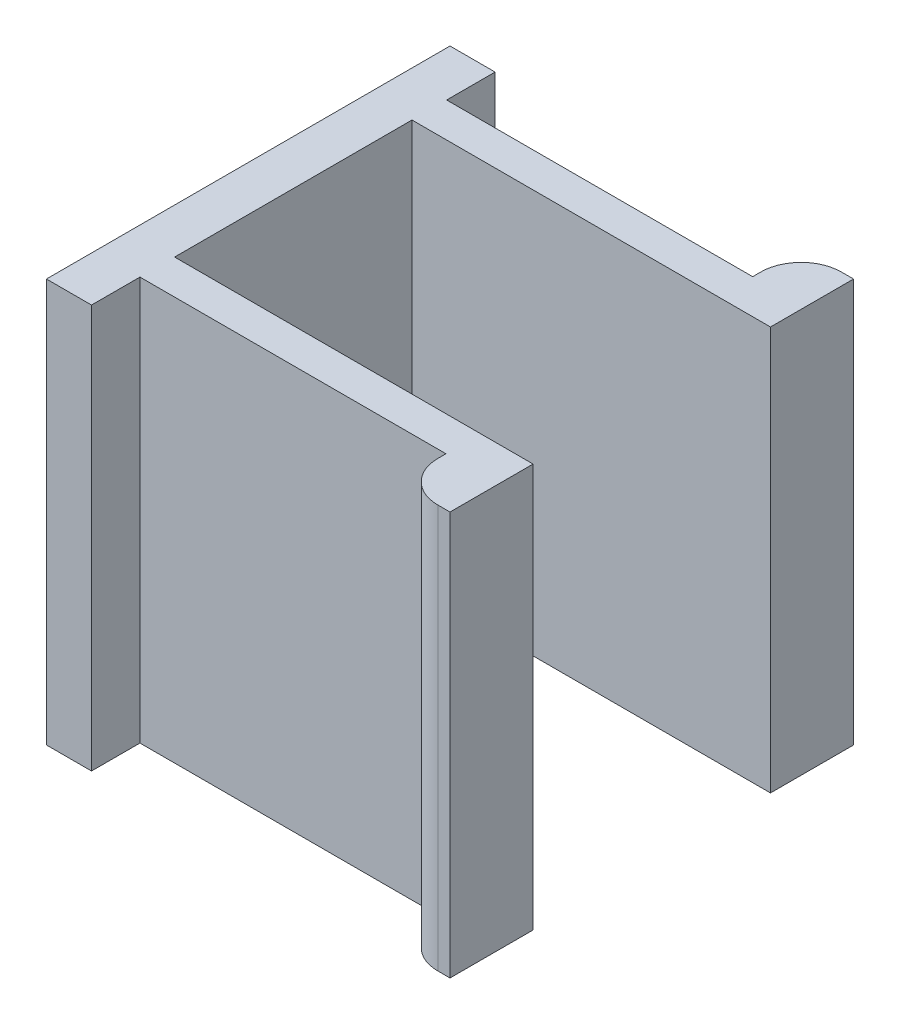
ISO-10303-21;
HEADER;
FILE_DESCRIPTION(('STEP AP214'),'2;1');
FILE_NAME('part.step','',(''),(''),'','','');
FILE_SCHEMA(('AUTOMOTIVE_DESIGN { 1 0 10303 214 1 1 1 1 }'));
ENDSEC;
DATA;
#1=APPLICATION_CONTEXT('core data for automotive mechanical design processes');
#2=APPLICATION_PROTOCOL_DEFINITION('international standard','automotive_design',2000,#1);
#3=PRODUCT_CONTEXT('',#1,'mechanical');
#4=PRODUCT('Part','Part','',(#3));
#5=PRODUCT_RELATED_PRODUCT_CATEGORY('part','',(#4));
#6=PRODUCT_DEFINITION_FORMATION('','',#4);
#7=PRODUCT_DEFINITION_CONTEXT('part definition',#1,'design');
#8=PRODUCT_DEFINITION('design','',#6,#7);
#9=PRODUCT_DEFINITION_SHAPE('','',#8);
#10=(LENGTH_UNIT() NAMED_UNIT(*) SI_UNIT(.MILLI.,.METRE.));
#11=(NAMED_UNIT(*) PLANE_ANGLE_UNIT() SI_UNIT($,.RADIAN.));
#12=(NAMED_UNIT(*) SI_UNIT($,.STERADIAN.) SOLID_ANGLE_UNIT());
#13=UNCERTAINTY_MEASURE_WITH_UNIT(LENGTH_MEASURE(1.E-05),#10,'distance_accuracy_value','');
#14=(GEOMETRIC_REPRESENTATION_CONTEXT(3) GLOBAL_UNCERTAINTY_ASSIGNED_CONTEXT((#13)) GLOBAL_UNIT_ASSIGNED_CONTEXT((#10,
#11,#12)) REPRESENTATION_CONTEXT('',''));
#15=CARTESIAN_POINT('',(0.,0.,0.));
#16=DIRECTION('',(0.,0.,1.));
#17=DIRECTION('',(1.,0.,0.));
#18=AXIS2_PLACEMENT_3D('',#15,#16,#17);
#19=CARTESIAN_POINT('',(-50.,100.,100.));
#20=DIRECTION('',(1.,0.,0.));
#21=DIRECTION('',(0.,1.,0.));
#22=AXIS2_PLACEMENT_3D('',#19,#20,#21);
#23=PLANE('',#22);
#24=DIRECTION('',(0.,-1.,0.));
#25=VECTOR('',#24,1.);
#26=CARTESIAN_POINT('',(-50.,100.,0.));
#27=LINE('',#26,#25);
#28=CARTESIAN_POINT('',(-50.,100.,0.));
#29=VERTEX_POINT('',#28);
#30=CARTESIAN_POINT('',(-50.,0.,0.));
#31=VERTEX_POINT('',#30);
#32=EDGE_CURVE('E292',#29,#31,#27,.T.);
#33=ORIENTED_EDGE('',*,*,#32,.T.);
#34=DIRECTION('',(0.,0.,-1.));
#35=VECTOR('',#34,1.);
#36=CARTESIAN_POINT('',(-50.,0.,100.));
#37=LINE('',#36,#35);
#38=CARTESIAN_POINT('',(-50.,0.,100.));
#39=VERTEX_POINT('',#38);
#40=EDGE_CURVE('E11',#39,#31,#37,.T.);
#41=ORIENTED_EDGE('',*,*,#40,.F.);
#42=DIRECTION('',(0.,-1.,0.));
#43=VECTOR('',#42,1.);
#44=CARTESIAN_POINT('',(-50.,100.,100.));
#45=LINE('',#44,#43);
#46=CARTESIAN_POINT('',(-50.,100.,100.));
#47=VERTEX_POINT('',#46);
#48=EDGE_CURVE('E298',#47,#39,#45,.T.);
#49=ORIENTED_EDGE('',*,*,#48,.F.);
#50=DIRECTION('',(0.,0.,-1.));
#51=VECTOR('',#50,1.);
#52=CARTESIAN_POINT('',(-50.,100.,100.));
#53=LINE('',#52,#51);
#54=EDGE_CURVE('E312',#47,#29,#53,.T.);
#55=ORIENTED_EDGE('',*,*,#54,.T.);
#56=EDGE_LOOP('',(#33,#41,#49,#55));
#57=FACE_BOUND('',#56,.T.);
#58=DIRECTION('',(0.,1.,0.));
#59=VECTOR('',#58,1.);
#60=CARTESIAN_POINT('',(-50.,5.86274890767412,93.4827144054893));
#61=LINE('',#60,#59);
#62=CARTESIAN_POINT('',(-50.,5.86274890767412,93.4827144054893));
#63=VERTEX_POINT('',#62);
#64=CARTESIAN_POINT('',(-50.,94.3657532036184,93.4827144054893));
#65=VERTEX_POINT('',#64);
#66=EDGE_CURVE('E201',#63,#65,#61,.T.);
#67=ORIENTED_EDGE('',*,*,#66,.F.);
#68=DIRECTION('',(0.,0.,1.));
#69=VECTOR('',#68,1.);
#70=CARTESIAN_POINT('',(-50.,5.86274890767412,93.4827144054893));
#71=LINE('',#70,#69);
#72=CARTESIAN_POINT('',(-50.,5.86274890767413,4.74875399562791));
#73=VERTEX_POINT('',#72);
#74=EDGE_CURVE('E198',#73,#63,#71,.T.);
#75=ORIENTED_EDGE('',*,*,#74,.F.);
#76=DIRECTION('',(0.,-1.,0.));
#77=VECTOR('',#76,1.);
#78=CARTESIAN_POINT('',(-50.,5.86274890767412,4.74875399562791));
#79=LINE('',#78,#77);
#80=CARTESIAN_POINT('',(-50.,94.3657532036184,4.74875399562791));
#81=VERTEX_POINT('',#80);
#82=EDGE_CURVE('E52',#81,#73,#79,.T.);
#83=ORIENTED_EDGE('',*,*,#82,.F.);
#84=DIRECTION('',(0.,0.,-1.));
#85=VECTOR('',#84,1.);
#86=CARTESIAN_POINT('',(-50.,94.3657532036184,93.4827144054893));
#87=LINE('',#86,#85);
#88=EDGE_CURVE('E47',#65,#81,#87,.T.);
#89=ORIENTED_EDGE('',*,*,#88,.F.);
#90=EDGE_LOOP('',(#67,#75,#83,#89));
#91=FACE_BOUND('',#90,.T.);
#92=ADVANCED_FACE('F33',(#57,#91),#23,.F.);
#93=CARTESIAN_POINT('',(-50.,0.,100.));
#94=DIRECTION('',(0.,1.,0.));
#95=DIRECTION('',(0.,0.,1.));
#96=AXIS2_PLACEMENT_3D('',#93,#94,#95);
#97=PLANE('',#96);
#98=CARTESIAN_POINT('',(47.,0.,90.));
#99=DIRECTION('',(0.,1.,0.));
#100=DIRECTION('',(0.,0.,1.));
#101=AXIS2_PLACEMENT_3D('',#98,#99,#100);
#102=CIRCLE('',#101,10.);
#103=CARTESIAN_POINT('',(37.,0.,89.9999999999999));
#104=VERTEX_POINT('',#103);
#105=CARTESIAN_POINT('',(47.0000000000001,0.,100.));
#106=VERTEX_POINT('',#105);
#107=EDGE_CURVE('E211',#104,#106,#102,.T.);
#108=ORIENTED_EDGE('',*,*,#107,.F.);
#109=DIRECTION('',(0.,0.,1.));
#110=VECTOR('',#109,1.);
#111=CARTESIAN_POINT('',(37.,0.,0.));
#112=LINE('',#111,#110);
#113=CARTESIAN_POINT('',(37.,0.,88.));
#114=VERTEX_POINT('',#113);
#115=EDGE_CURVE('E213',#114,#104,#112,.T.);
#116=ORIENTED_EDGE('',*,*,#115,.F.);
#117=DIRECTION('',(1.,0.,0.));
#118=VECTOR('',#117,1.);
#119=CARTESIAN_POINT('',(0.,0.,88.));
#120=LINE('',#119,#118);
#121=CARTESIAN_POINT('',(-38.8271021950146,0.,88.));
#122=VERTEX_POINT('',#121);
#123=EDGE_CURVE('E216',#122,#114,#120,.T.);
#124=ORIENTED_EDGE('',*,*,#123,.F.);
#125=DIRECTION('',(0.,0.,-1.));
#126=VECTOR('',#125,1.);
#127=CARTESIAN_POINT('',(-38.8271021950146,0.,0.));
#128=LINE('',#127,#126);
#129=CARTESIAN_POINT('',(-38.8271021950146,0.,100.));
#130=VERTEX_POINT('',#129);
#131=EDGE_CURVE('E218',#130,#122,#128,.T.);
#132=ORIENTED_EDGE('',*,*,#131,.F.);
#133=DIRECTION('',(1.,0.,0.));
#134=VECTOR('',#133,1.);
#135=CARTESIAN_POINT('',(-50.,0.,100.));
#136=LINE('',#135,#134);
#137=EDGE_CURVE('E303',#39,#130,#136,.T.);
#138=ORIENTED_EDGE('',*,*,#137,.F.);
#139=ORIENTED_EDGE('',*,*,#40,.T.);
#140=DIRECTION('',(1.,0.,0.));
#141=VECTOR('',#140,1.);
#142=CARTESIAN_POINT('',(-50.,0.,0.));
#143=LINE('',#142,#141);
#144=CARTESIAN_POINT('',(-38.8271021950146,0.,0.));
#145=VERTEX_POINT('',#144);
#146=EDGE_CURVE('E316',#31,#145,#143,.T.);
#147=ORIENTED_EDGE('',*,*,#146,.T.);
#148=DIRECTION('',(0.,0.,1.));
#149=VECTOR('',#148,1.);
#150=CARTESIAN_POINT('',(-38.8271021950146,0.,0.));
#151=LINE('',#150,#149);
#152=CARTESIAN_POINT('',(-38.8271021950146,0.,12.));
#153=VERTEX_POINT('',#152);
#154=EDGE_CURVE('E251',#145,#153,#151,.T.);
#155=ORIENTED_EDGE('',*,*,#154,.T.);
#156=DIRECTION('',(1.,0.,0.));
#157=VECTOR('',#156,1.);
#158=CARTESIAN_POINT('',(0.,0.,12.));
#159=LINE('',#158,#157);
#160=CARTESIAN_POINT('',(37.,0.,12.));
#161=VERTEX_POINT('',#160);
#162=EDGE_CURVE('E254',#153,#161,#159,.T.);
#163=ORIENTED_EDGE('',*,*,#162,.T.);
#164=DIRECTION('',(0.,0.,-1.));
#165=VECTOR('',#164,1.);
#166=CARTESIAN_POINT('',(37.,0.,0.));
#167=LINE('',#166,#165);
#168=CARTESIAN_POINT('',(37.,0.,10.0000000000001));
#169=VERTEX_POINT('',#168);
#170=EDGE_CURVE('E244',#161,#169,#167,.T.);
#171=ORIENTED_EDGE('',*,*,#170,.T.);
#172=CARTESIAN_POINT('',(47.,0.,10.));
#173=DIRECTION('',(0.,1.,0.));
#174=DIRECTION('',(0.,0.,1.));
#175=AXIS2_PLACEMENT_3D('',#172,#173,#174);
#176=CIRCLE('',#175,10.);
#177=CARTESIAN_POINT('',(47.0000000000001,0.,0.));
#178=VERTEX_POINT('',#177);
#179=EDGE_CURVE('E247',#169,#178,#176,.F.);
#180=ORIENTED_EDGE('',*,*,#179,.T.);
#181=CARTESIAN_POINT('',(50.,0.,0.));
#182=VERTEX_POINT('',#181);
#183=EDGE_CURVE('E315',#178,#182,#143,.T.);
#184=ORIENTED_EDGE('',*,*,#183,.T.);
#185=DIRECTION('',(0.,0.,-1.));
#186=VECTOR('',#185,1.);
#187=CARTESIAN_POINT('',(50.,0.,100.));
#188=LINE('',#187,#186);
#189=CARTESIAN_POINT('',(50.,0.,20.5892609371631));
#190=VERTEX_POINT('',#189);
#191=EDGE_CURVE('E330',#190,#182,#188,.T.);
#192=ORIENTED_EDGE('',*,*,#191,.F.);
#193=DIRECTION('',(-1.,0.,0.));
#194=VECTOR('',#193,1.);
#195=CARTESIAN_POINT('',(0.,0.,20.5892609371631));
#196=LINE('',#195,#194);
#197=CARTESIAN_POINT('',(-38.8271021950146,0.,20.5892609371631));
#198=VERTEX_POINT('',#197);
#199=EDGE_CURVE('E273',#190,#198,#196,.T.);
#200=ORIENTED_EDGE('',*,*,#199,.T.);
#201=DIRECTION('',(0.,0.,-1.));
#202=VECTOR('',#201,1.);
#203=CARTESIAN_POINT('',(-38.8271021950146,0.,0.));
#204=LINE('',#203,#202);
#205=CARTESIAN_POINT('',(-38.8271021950146,0.,79.4107390628369));
#206=VERTEX_POINT('',#205);
#207=EDGE_CURVE('E276',#206,#198,#204,.T.);
#208=ORIENTED_EDGE('',*,*,#207,.F.);
#209=DIRECTION('',(-1.,0.,0.));
#210=VECTOR('',#209,1.);
#211=CARTESIAN_POINT('',(0.,0.,79.4107390628369));
#212=LINE('',#211,#210);
#213=CARTESIAN_POINT('',(50.,0.,79.4107390628369));
#214=VERTEX_POINT('',#213);
#215=EDGE_CURVE('E279',#214,#206,#212,.T.);
#216=ORIENTED_EDGE('',*,*,#215,.F.);
#217=CARTESIAN_POINT('',(50.,0.,100.));
#218=VERTEX_POINT('',#217);
#219=EDGE_CURVE('E40',#218,#214,#188,.T.);
#220=ORIENTED_EDGE('',*,*,#219,.F.);
#221=EDGE_CURVE('E301',#106,#218,#136,.T.);
#222=ORIENTED_EDGE('',*,*,#221,.F.);
#223=EDGE_LOOP('',(#108,#116,#124,#132,#138,#139,#147,#155,#163,#171,#180,#184,#192,#200,#208,
#216,#220,#222));
#224=FACE_BOUND('',#223,.T.);
#225=ADVANCED_FACE('F358',(#224),#97,.F.);
#226=CARTESIAN_POINT('',(-50.,100.,100.));
#227=DIRECTION('',(0.,-1.,0.));
#228=DIRECTION('',(0.,0.,-1.));
#229=AXIS2_PLACEMENT_3D('',#226,#227,#228);
#230=PLANE('',#229);
#231=CARTESIAN_POINT('',(47.,100.,90.));
#232=DIRECTION('',(0.,1.,0.));
#233=DIRECTION('',(0.,0.,1.));
#234=AXIS2_PLACEMENT_3D('',#231,#232,#233);
#235=CIRCLE('',#234,10.);
#236=CARTESIAN_POINT('',(37.,100.,89.9999999999999));
#237=VERTEX_POINT('',#236);
#238=CARTESIAN_POINT('',(47.0000000000001,100.,100.));
#239=VERTEX_POINT('',#238);
#240=EDGE_CURVE('E221',#237,#239,#235,.T.);
#241=ORIENTED_EDGE('',*,*,#240,.T.);
#242=DIRECTION('',(-1.,0.,0.));
#243=VECTOR('',#242,1.);
#244=CARTESIAN_POINT('',(-50.,100.,100.));
#245=LINE('',#244,#243);
#246=CARTESIAN_POINT('',(50.,100.,100.));
#247=VERTEX_POINT('',#246);
#248=EDGE_CURVE('E309',#247,#239,#245,.T.);
#249=ORIENTED_EDGE('',*,*,#248,.F.);
#250=DIRECTION('',(0.,0.,-1.));
#251=VECTOR('',#250,1.);
#252=CARTESIAN_POINT('',(50.,100.,100.));
#253=LINE('',#252,#251);
#254=CARTESIAN_POINT('',(50.,100.,79.4107390628369));
#255=VERTEX_POINT('',#254);
#256=EDGE_CURVE('E328',#247,#255,#253,.T.);
#257=ORIENTED_EDGE('',*,*,#256,.T.);
#258=DIRECTION('',(-1.,0.,0.));
#259=VECTOR('',#258,1.);
#260=CARTESIAN_POINT('',(0.,100.,79.4107390628369));
#261=LINE('',#260,#259);
#262=CARTESIAN_POINT('',(-38.8271021950146,100.,79.4107390628369));
#263=VERTEX_POINT('',#262);
#264=EDGE_CURVE('E277',#255,#263,#261,.T.);
#265=ORIENTED_EDGE('',*,*,#264,.T.);
#266=DIRECTION('',(0.,0.,-1.));
#267=VECTOR('',#266,1.);
#268=CARTESIAN_POINT('',(-38.8271021950146,100.,0.));
#269=LINE('',#268,#267);
#270=CARTESIAN_POINT('',(-38.8271021950146,100.,20.5892609371631));
#271=VERTEX_POINT('',#270);
#272=EDGE_CURVE('E284',#263,#271,#269,.T.);
#273=ORIENTED_EDGE('',*,*,#272,.T.);
#274=DIRECTION('',(-1.,0.,0.));
#275=VECTOR('',#274,1.);
#276=CARTESIAN_POINT('',(0.,100.,20.5892609371631));
#277=LINE('',#276,#275);
#278=CARTESIAN_POINT('',(50.,100.,20.5892609371631));
#279=VERTEX_POINT('',#278);
#280=EDGE_CURVE('E235',#279,#271,#277,.T.);
#281=ORIENTED_EDGE('',*,*,#280,.F.);
#282=CARTESIAN_POINT('',(50.,100.,0.));
#283=VERTEX_POINT('',#282);
#284=EDGE_CURVE('E327',#279,#283,#253,.T.);
#285=ORIENTED_EDGE('',*,*,#284,.T.);
#286=DIRECTION('',(-1.,0.,0.));
#287=VECTOR('',#286,1.);
#288=CARTESIAN_POINT('',(-50.,100.,0.));
#289=LINE('',#288,#287);
#290=CARTESIAN_POINT('',(47.0000000000001,100.,0.));
#291=VERTEX_POINT('',#290);
#292=EDGE_CURVE('E302',#283,#291,#289,.T.);
#293=ORIENTED_EDGE('',*,*,#292,.T.);
#294=CARTESIAN_POINT('',(47.,100.,10.));
#295=DIRECTION('',(0.,1.,0.));
#296=DIRECTION('',(0.,0.,1.));
#297=AXIS2_PLACEMENT_3D('',#294,#295,#296);
#298=CIRCLE('',#297,10.);
#299=CARTESIAN_POINT('',(37.,100.,10.0000000000001));
#300=VERTEX_POINT('',#299);
#301=EDGE_CURVE('E205',#300,#291,#298,.F.);
#302=ORIENTED_EDGE('',*,*,#301,.F.);
#303=DIRECTION('',(0.,0.,-1.));
#304=VECTOR('',#303,1.);
#305=CARTESIAN_POINT('',(37.,100.,0.));
#306=LINE('',#305,#304);
#307=CARTESIAN_POINT('',(37.,100.,12.));
#308=VERTEX_POINT('',#307);
#309=EDGE_CURVE('E202',#308,#300,#306,.T.);
#310=ORIENTED_EDGE('',*,*,#309,.F.);
#311=DIRECTION('',(1.,0.,0.));
#312=VECTOR('',#311,1.);
#313=CARTESIAN_POINT('',(0.,100.,12.));
#314=LINE('',#313,#312);
#315=CARTESIAN_POINT('',(-38.8271021950146,100.,12.));
#316=VERTEX_POINT('',#315);
#317=EDGE_CURVE('E248',#316,#308,#314,.T.);
#318=ORIENTED_EDGE('',*,*,#317,.F.);
#319=DIRECTION('',(0.,0.,1.));
#320=VECTOR('',#319,1.);
#321=CARTESIAN_POINT('',(-38.8271021950146,100.,0.));
#322=LINE('',#321,#320);
#323=CARTESIAN_POINT('',(-38.8271021950146,100.,0.));
#324=VERTEX_POINT('',#323);
#325=EDGE_CURVE('E259',#324,#316,#322,.T.);
#326=ORIENTED_EDGE('',*,*,#325,.F.);
#327=EDGE_CURVE('E322',#324,#29,#289,.T.);
#328=ORIENTED_EDGE('',*,*,#327,.T.);
#329=ORIENTED_EDGE('',*,*,#54,.F.);
#330=CARTESIAN_POINT('',(-38.8271021950146,100.,100.));
#331=VERTEX_POINT('',#330);
#332=EDGE_CURVE('E308',#331,#47,#245,.T.);
#333=ORIENTED_EDGE('',*,*,#332,.F.);
#334=DIRECTION('',(0.,0.,-1.));
#335=VECTOR('',#334,1.);
#336=CARTESIAN_POINT('',(-38.8271021950146,100.,0.));
#337=LINE('',#336,#335);
#338=CARTESIAN_POINT('',(-38.8271021950146,100.,88.));
#339=VERTEX_POINT('',#338);
#340=EDGE_CURVE('E214',#331,#339,#337,.T.);
#341=ORIENTED_EDGE('',*,*,#340,.T.);
#342=DIRECTION('',(1.,0.,0.));
#343=VECTOR('',#342,1.);
#344=CARTESIAN_POINT('',(0.,100.,88.));
#345=LINE('',#344,#343);
#346=CARTESIAN_POINT('',(37.,100.,88.));
#347=VERTEX_POINT('',#346);
#348=EDGE_CURVE('E228',#339,#347,#345,.T.);
#349=ORIENTED_EDGE('',*,*,#348,.T.);
#350=DIRECTION('',(0.,0.,1.));
#351=VECTOR('',#350,1.);
#352=CARTESIAN_POINT('',(37.,100.,0.));
#353=LINE('',#352,#351);
#354=EDGE_CURVE('E224',#347,#237,#353,.T.);
#355=ORIENTED_EDGE('',*,*,#354,.T.);
#356=EDGE_LOOP('',(#241,#249,#257,#265,#273,#281,#285,#293,#302,#310,#318,#326,#328,#329,#333,
#341,#349,#355));
#357=FACE_BOUND('',#356,.T.);
#358=ADVANCED_FACE('F349',(#357),#230,.F.);
#359=CARTESIAN_POINT('',(0.,0.,100.));
#360=DIRECTION('',(0.,0.,1.));
#361=DIRECTION('',(1.,0.,0.));
#362=AXIS2_PLACEMENT_3D('',#359,#360,#361);
#363=PLANE('',#362);
#364=ORIENTED_EDGE('',*,*,#137,.T.);
#365=DIRECTION('',(0.,1.,0.));
#366=VECTOR('',#365,1.);
#367=CARTESIAN_POINT('',(-38.8271021950146,0.,100.));
#368=LINE('',#367,#366);
#369=EDGE_CURVE('E236',#130,#331,#368,.T.);
#370=ORIENTED_EDGE('',*,*,#369,.T.);
#371=ORIENTED_EDGE('',*,*,#332,.T.);
#372=ORIENTED_EDGE('',*,*,#48,.T.);
#373=EDGE_LOOP('',(#364,#370,#371,#372));
#374=FACE_BOUND('',#373,.T.);
#375=ADVANCED_FACE('F389',(#374),#363,.T.);
#376=CARTESIAN_POINT('',(0.,0.,0.));
#377=DIRECTION('',(0.,0.,1.));
#378=DIRECTION('',(1.,0.,0.));
#379=AXIS2_PLACEMENT_3D('',#376,#377,#378);
#380=PLANE('',#379);
#381=DIRECTION('',(0.,1.,0.));
#382=VECTOR('',#381,1.);
#383=CARTESIAN_POINT('',(47.0000000000001,0.,0.));
#384=LINE('',#383,#382);
#385=EDGE_CURVE('E269',#178,#291,#384,.T.);
#386=ORIENTED_EDGE('',*,*,#385,.T.);
#387=ORIENTED_EDGE('',*,*,#292,.F.);
#388=DIRECTION('',(0.,1.,0.));
#389=VECTOR('',#388,1.);
#390=CARTESIAN_POINT('',(50.,100.,0.));
#391=LINE('',#390,#389);
#392=EDGE_CURVE('E319',#182,#283,#391,.T.);
#393=ORIENTED_EDGE('',*,*,#392,.F.);
#394=ORIENTED_EDGE('',*,*,#183,.F.);
#395=EDGE_LOOP('',(#386,#387,#393,#394));
#396=FACE_BOUND('',#395,.T.);
#397=ADVANCED_FACE('F346',(#396),#380,.F.);
#398=CARTESIAN_POINT('',(50.,100.,100.));
#399=DIRECTION('',(-1.,0.,0.));
#400=DIRECTION('',(0.,-1.,0.));
#401=AXIS2_PLACEMENT_3D('',#398,#399,#400);
#402=PLANE('',#401);
#403=DIRECTION('',(0.,1.,0.));
#404=VECTOR('',#403,1.);
#405=CARTESIAN_POINT('',(50.,0.,79.4107390628369));
#406=LINE('',#405,#404);
#407=EDGE_CURVE('E289',#214,#255,#406,.T.);
#408=ORIENTED_EDGE('',*,*,#407,.T.);
#409=ORIENTED_EDGE('',*,*,#256,.F.);
#410=DIRECTION('',(0.,1.,0.));
#411=VECTOR('',#410,1.);
#412=CARTESIAN_POINT('',(50.,100.,100.));
#413=LINE('',#412,#411);
#414=EDGE_CURVE('E306',#218,#247,#413,.T.);
#415=ORIENTED_EDGE('',*,*,#414,.F.);
#416=ORIENTED_EDGE('',*,*,#219,.T.);
#417=EDGE_LOOP('',(#408,#409,#415,#416));
#418=FACE_BOUND('',#417,.T.);
#419=ADVANCED_FACE('F366',(#418),#402,.F.);
#420=ORIENTED_EDGE('',*,*,#284,.F.);
#421=DIRECTION('',(0.,1.,0.));
#422=VECTOR('',#421,1.);
#423=CARTESIAN_POINT('',(50.,0.,20.5892609371631));
#424=LINE('',#423,#422);
#425=EDGE_CURVE('E281',#190,#279,#424,.T.);
#426=ORIENTED_EDGE('',*,*,#425,.F.);
#427=ORIENTED_EDGE('',*,*,#191,.T.);
#428=ORIENTED_EDGE('',*,*,#392,.T.);
#429=EDGE_LOOP('',(#420,#426,#427,#428));
#430=FACE_BOUND('',#429,.T.);
#431=ADVANCED_FACE('F341',(#430),#402,.F.);
#432=DIRECTION('',(0.,1.,0.));
#433=VECTOR('',#432,1.);
#434=CARTESIAN_POINT('',(47.0000000000001,0.,100.));
#435=LINE('',#434,#433);
#436=EDGE_CURVE('E233',#106,#239,#435,.T.);
#437=ORIENTED_EDGE('',*,*,#436,.F.);
#438=ORIENTED_EDGE('',*,*,#221,.T.);
#439=ORIENTED_EDGE('',*,*,#414,.T.);
#440=ORIENTED_EDGE('',*,*,#248,.T.);
#441=EDGE_LOOP('',(#437,#438,#439,#440));
#442=FACE_BOUND('',#441,.T.);
#443=ADVANCED_FACE('F371',(#442),#363,.T.);
#444=ORIENTED_EDGE('',*,*,#327,.F.);
#445=DIRECTION('',(0.,1.,0.));
#446=VECTOR('',#445,1.);
#447=CARTESIAN_POINT('',(-38.8271021950146,0.,0.));
#448=LINE('',#447,#446);
#449=EDGE_CURVE('E267',#145,#324,#448,.T.);
#450=ORIENTED_EDGE('',*,*,#449,.F.);
#451=ORIENTED_EDGE('',*,*,#146,.F.);
#452=ORIENTED_EDGE('',*,*,#32,.F.);
#453=EDGE_LOOP('',(#444,#450,#451,#452));
#454=FACE_BOUND('',#453,.T.);
#455=ADVANCED_FACE('F399',(#454),#380,.F.);
#456=CARTESIAN_POINT('',(0.,0.,79.4107390628369));
#457=DIRECTION('',(0.,0.,-1.));
#458=DIRECTION('',(-1.,0.,0.));
#459=AXIS2_PLACEMENT_3D('',#456,#457,#458);
#460=PLANE('',#459);
#461=ORIENTED_EDGE('',*,*,#264,.F.);
#462=ORIENTED_EDGE('',*,*,#407,.F.);
#463=ORIENTED_EDGE('',*,*,#215,.T.);
#464=DIRECTION('',(0.,1.,0.));
#465=VECTOR('',#464,1.);
#466=CARTESIAN_POINT('',(-38.8271021950146,0.,79.4107390628369));
#467=LINE('',#466,#465);
#468=EDGE_CURVE('E293',#206,#263,#467,.T.);
#469=ORIENTED_EDGE('',*,*,#468,.T.);
#470=EDGE_LOOP('',(#461,#462,#463,#469));
#471=FACE_BOUND('',#470,.T.);
#472=ADVANCED_FACE('F364',(#471),#460,.T.);
#473=CARTESIAN_POINT('',(-38.8271021950146,0.,0.));
#474=DIRECTION('',(1.,0.,0.));
#475=DIRECTION('',(0.,0.,-1.));
#476=AXIS2_PLACEMENT_3D('',#473,#474,#475);
#477=PLANE('',#476);
#478=ORIENTED_EDGE('',*,*,#272,.F.);
#479=ORIENTED_EDGE('',*,*,#468,.F.);
#480=ORIENTED_EDGE('',*,*,#207,.T.);
#481=DIRECTION('',(0.,1.,0.));
#482=VECTOR('',#481,1.);
#483=CARTESIAN_POINT('',(-38.8271021950146,0.,20.5892609371631));
#484=LINE('',#483,#482);
#485=EDGE_CURVE('E295',#198,#271,#484,.T.);
#486=ORIENTED_EDGE('',*,*,#485,.T.);
#487=EDGE_LOOP('',(#478,#479,#480,#486));
#488=FACE_BOUND('',#487,.T.);
#489=ADVANCED_FACE('F362',(#488),#477,.T.);
#490=CARTESIAN_POINT('',(0.,0.,20.5892609371631));
#491=DIRECTION('',(0.,0.,-1.));
#492=DIRECTION('',(-1.,0.,0.));
#493=AXIS2_PLACEMENT_3D('',#490,#491,#492);
#494=PLANE('',#493);
#495=ORIENTED_EDGE('',*,*,#280,.T.);
#496=ORIENTED_EDGE('',*,*,#485,.F.);
#497=ORIENTED_EDGE('',*,*,#199,.F.);
#498=ORIENTED_EDGE('',*,*,#425,.T.);
#499=EDGE_LOOP('',(#495,#496,#497,#498));
#500=FACE_BOUND('',#499,.T.);
#501=ADVANCED_FACE('F355',(#500),#494,.F.);
#502=CARTESIAN_POINT('',(37.,0.,0.));
#503=DIRECTION('',(1.,0.,0.));
#504=DIRECTION('',(0.,0.,-1.));
#505=AXIS2_PLACEMENT_3D('',#502,#503,#504);
#506=PLANE('',#505);
#507=ORIENTED_EDGE('',*,*,#309,.T.);
#508=DIRECTION('',(0.,1.,0.));
#509=VECTOR('',#508,1.);
#510=CARTESIAN_POINT('',(37.,0.,10.0000000000001));
#511=LINE('',#510,#509);
#512=EDGE_CURVE('E256',#169,#300,#511,.T.);
#513=ORIENTED_EDGE('',*,*,#512,.F.);
#514=ORIENTED_EDGE('',*,*,#170,.F.);
#515=DIRECTION('',(0.,1.,0.));
#516=VECTOR('',#515,1.);
#517=CARTESIAN_POINT('',(37.,0.,12.));
#518=LINE('',#517,#516);
#519=EDGE_CURVE('E225',#161,#308,#518,.T.);
#520=ORIENTED_EDGE('',*,*,#519,.T.);
#521=EDGE_LOOP('',(#507,#513,#514,#520));
#522=FACE_BOUND('',#521,.T.);
#523=ADVANCED_FACE('F410',(#522),#506,.F.);
#524=CARTESIAN_POINT('',(0.,0.,12.));
#525=DIRECTION('',(0.,0.,1.));
#526=DIRECTION('',(1.,0.,0.));
#527=AXIS2_PLACEMENT_3D('',#524,#525,#526);
#528=PLANE('',#527);
#529=ORIENTED_EDGE('',*,*,#317,.T.);
#530=ORIENTED_EDGE('',*,*,#519,.F.);
#531=ORIENTED_EDGE('',*,*,#162,.F.);
#532=DIRECTION('',(0.,1.,0.));
#533=VECTOR('',#532,1.);
#534=CARTESIAN_POINT('',(-38.8271021950146,0.,12.));
#535=LINE('',#534,#533);
#536=EDGE_CURVE('E265',#153,#316,#535,.T.);
#537=ORIENTED_EDGE('',*,*,#536,.T.);
#538=EDGE_LOOP('',(#529,#530,#531,#537));
#539=FACE_BOUND('',#538,.T.);
#540=ADVANCED_FACE('F405',(#539),#528,.F.);
#541=CARTESIAN_POINT('',(-38.8271021950146,0.,0.));
#542=DIRECTION('',(-1.,0.,0.));
#543=DIRECTION('',(0.,0.,1.));
#544=AXIS2_PLACEMENT_3D('',#541,#542,#543);
#545=PLANE('',#544);
#546=ORIENTED_EDGE('',*,*,#325,.T.);
#547=ORIENTED_EDGE('',*,*,#536,.F.);
#548=ORIENTED_EDGE('',*,*,#154,.F.);
#549=ORIENTED_EDGE('',*,*,#449,.T.);
#550=EDGE_LOOP('',(#546,#547,#548,#549));
#551=FACE_BOUND('',#550,.T.);
#552=ADVANCED_FACE('F402',(#551),#545,.F.);
#553=CARTESIAN_POINT('',(47.,0.,10.));
#554=DIRECTION('',(0.,1.,0.));
#555=DIRECTION('',(0.,0.,1.));
#556=AXIS2_PLACEMENT_3D('',#553,#554,#555);
#557=CYLINDRICAL_SURFACE('',#556,10.);
#558=ORIENTED_EDGE('',*,*,#301,.T.);
#559=ORIENTED_EDGE('',*,*,#385,.F.);
#560=ORIENTED_EDGE('',*,*,#179,.F.);
#561=ORIENTED_EDGE('',*,*,#512,.T.);
#562=EDGE_LOOP('',(#558,#559,#560,#561));
#563=FACE_BOUND('',#562,.T.);
#564=ADVANCED_FACE('F412',(#563),#557,.T.);
#565=CARTESIAN_POINT('',(47.,0.,90.));
#566=DIRECTION('',(0.,1.,0.));
#567=DIRECTION('',(0.,0.,1.));
#568=AXIS2_PLACEMENT_3D('',#565,#566,#567);
#569=CYLINDRICAL_SURFACE('',#568,10.);
#570=ORIENTED_EDGE('',*,*,#240,.F.);
#571=DIRECTION('',(0.,1.,0.));
#572=VECTOR('',#571,1.);
#573=CARTESIAN_POINT('',(37.,0.,89.9999999999999));
#574=LINE('',#573,#572);
#575=EDGE_CURVE('E220',#104,#237,#574,.T.);
#576=ORIENTED_EDGE('',*,*,#575,.F.);
#577=ORIENTED_EDGE('',*,*,#107,.T.);
#578=ORIENTED_EDGE('',*,*,#436,.T.);
#579=EDGE_LOOP('',(#570,#576,#577,#578));
#580=FACE_BOUND('',#579,.T.);
#581=ADVANCED_FACE('F377',(#580),#569,.T.);
#582=CARTESIAN_POINT('',(-38.8271021950146,0.,0.));
#583=DIRECTION('',(1.,0.,0.));
#584=DIRECTION('',(0.,0.,-1.));
#585=AXIS2_PLACEMENT_3D('',#582,#583,#584);
#586=PLANE('',#585);
#587=ORIENTED_EDGE('',*,*,#340,.F.);
#588=ORIENTED_EDGE('',*,*,#369,.F.);
#589=ORIENTED_EDGE('',*,*,#131,.T.);
#590=DIRECTION('',(0.,1.,0.));
#591=VECTOR('',#590,1.);
#592=CARTESIAN_POINT('',(-38.8271021950146,0.,88.));
#593=LINE('',#592,#591);
#594=EDGE_CURVE('E239',#122,#339,#593,.T.);
#595=ORIENTED_EDGE('',*,*,#594,.T.);
#596=EDGE_LOOP('',(#587,#588,#589,#595));
#597=FACE_BOUND('',#596,.T.);
#598=ADVANCED_FACE('F419',(#597),#586,.T.);
#599=CARTESIAN_POINT('',(0.,0.,88.));
#600=DIRECTION('',(0.,0.,1.));
#601=DIRECTION('',(1.,0.,0.));
#602=AXIS2_PLACEMENT_3D('',#599,#600,#601);
#603=PLANE('',#602);
#604=ORIENTED_EDGE('',*,*,#348,.F.);
#605=ORIENTED_EDGE('',*,*,#594,.F.);
#606=ORIENTED_EDGE('',*,*,#123,.T.);
#607=DIRECTION('',(0.,1.,0.));
#608=VECTOR('',#607,1.);
#609=CARTESIAN_POINT('',(37.,0.,88.));
#610=LINE('',#609,#608);
#611=EDGE_CURVE('E241',#114,#347,#610,.T.);
#612=ORIENTED_EDGE('',*,*,#611,.T.);
#613=EDGE_LOOP('',(#604,#605,#606,#612));
#614=FACE_BOUND('',#613,.T.);
#615=ADVANCED_FACE('F384',(#614),#603,.T.);
#616=CARTESIAN_POINT('',(37.,0.,0.));
#617=DIRECTION('',(-1.,0.,0.));
#618=DIRECTION('',(0.,0.,1.));
#619=AXIS2_PLACEMENT_3D('',#616,#617,#618);
#620=PLANE('',#619);
#621=ORIENTED_EDGE('',*,*,#354,.F.);
#622=ORIENTED_EDGE('',*,*,#611,.F.);
#623=ORIENTED_EDGE('',*,*,#115,.T.);
#624=ORIENTED_EDGE('',*,*,#575,.T.);
#625=EDGE_LOOP('',(#621,#622,#623,#624));
#626=FACE_BOUND('',#625,.T.);
#627=ADVANCED_FACE('F380',(#626),#620,.T.);
#628=CARTESIAN_POINT('',(-53.,5.86274890767412,93.4827144054893));
#629=DIRECTION('',(0.,0.,-1.));
#630=DIRECTION('',(-1.,0.,0.));
#631=AXIS2_PLACEMENT_3D('',#628,#629,#630);
#632=PLANE('',#631);
#633=ORIENTED_EDGE('',*,*,#66,.T.);
#634=DIRECTION('',(1.,0.,0.));
#635=VECTOR('',#634,1.);
#636=CARTESIAN_POINT('',(-53.,94.3657532036184,93.4827144054893));
#637=LINE('',#636,#635);
#638=CARTESIAN_POINT('',(-53.,94.3657532036184,93.4827144054893));
#639=VERTEX_POINT('',#638);
#640=EDGE_CURVE('E182',#639,#65,#637,.T.);
#641=ORIENTED_EDGE('',*,*,#640,.F.);
#642=DIRECTION('',(0.,1.,0.));
#643=VECTOR('',#642,1.);
#644=CARTESIAN_POINT('',(-53.,5.86274890767412,93.4827144054893));
#645=LINE('',#644,#643);
#646=CARTESIAN_POINT('',(-53.,5.86274890767412,93.4827144054893));
#647=VERTEX_POINT('',#646);
#648=EDGE_CURVE('E189',#647,#639,#645,.T.);
#649=ORIENTED_EDGE('',*,*,#648,.F.);
#650=DIRECTION('',(1.,0.,0.));
#651=VECTOR('',#650,1.);
#652=CARTESIAN_POINT('',(-53.,5.86274890767412,93.4827144054893));
#653=LINE('',#652,#651);
#654=EDGE_CURVE('E618',#647,#63,#653,.T.);
#655=ORIENTED_EDGE('',*,*,#654,.T.);
#656=EDGE_LOOP('',(#633,#641,#649,#655));
#657=FACE_BOUND('',#656,.T.);
#658=ADVANCED_FACE('F200',(#657),#632,.F.);
#659=CARTESIAN_POINT('',(-53.,94.3657532036184,93.4827144054893));
#660=DIRECTION('',(0.,-1.,0.));
#661=DIRECTION('',(1.,0.,0.));
#662=AXIS2_PLACEMENT_3D('',#659,#660,#661);
#663=PLANE('',#662);
#664=ORIENTED_EDGE('',*,*,#88,.T.);
#665=DIRECTION('',(1.,0.,0.));
#666=VECTOR('',#665,1.);
#667=CARTESIAN_POINT('',(-53.,94.3657532036184,4.74875399562791));
#668=LINE('',#667,#666);
#669=CARTESIAN_POINT('',(-53.,94.3657532036184,4.74875399562791));
#670=VERTEX_POINT('',#669);
#671=EDGE_CURVE('E185',#670,#81,#668,.T.);
#672=ORIENTED_EDGE('',*,*,#671,.F.);
#673=DIRECTION('',(0.,0.,-1.));
#674=VECTOR('',#673,1.);
#675=CARTESIAN_POINT('',(-53.,94.3657532036184,93.4827144054893));
#676=LINE('',#675,#674);
#677=EDGE_CURVE('E178',#639,#670,#676,.T.);
#678=ORIENTED_EDGE('',*,*,#677,.F.);
#679=ORIENTED_EDGE('',*,*,#640,.T.);
#680=EDGE_LOOP('',(#664,#672,#678,#679));
#681=FACE_BOUND('',#680,.T.);
#682=ADVANCED_FACE('F180',(#681),#663,.F.);
#683=CARTESIAN_POINT('',(-53.,5.86274890767412,4.74875399562791));
#684=DIRECTION('',(0.,0.,1.));
#685=DIRECTION('',(1.,0.,0.));
#686=AXIS2_PLACEMENT_3D('',#683,#684,#685);
#687=PLANE('',#686);
#688=ORIENTED_EDGE('',*,*,#82,.T.);
#689=DIRECTION('',(1.,0.,0.));
#690=VECTOR('',#689,1.);
#691=CARTESIAN_POINT('',(-53.,5.86274890767412,4.74875399562791));
#692=LINE('',#691,#690);
#693=CARTESIAN_POINT('',(-53.,5.86274890767412,4.74875399562791));
#694=VERTEX_POINT('',#693);
#695=EDGE_CURVE('E207',#694,#73,#692,.T.);
#696=ORIENTED_EDGE('',*,*,#695,.F.);
#697=DIRECTION('',(0.,-1.,0.));
#698=VECTOR('',#697,1.);
#699=CARTESIAN_POINT('',(-53.,5.86274890767412,4.74875399562791));
#700=LINE('',#699,#698);
#701=EDGE_CURVE('E188',#670,#694,#700,.T.);
#702=ORIENTED_EDGE('',*,*,#701,.F.);
#703=ORIENTED_EDGE('',*,*,#671,.T.);
#704=EDGE_LOOP('',(#688,#696,#702,#703));
#705=FACE_BOUND('',#704,.T.);
#706=ADVANCED_FACE('F461',(#705),#687,.F.);
#707=CARTESIAN_POINT('',(-53.,5.86274890767412,93.4827144054893));
#708=DIRECTION('',(0.,1.,0.));
#709=DIRECTION('',(-1.,0.,0.));
#710=AXIS2_PLACEMENT_3D('',#707,#708,#709);
#711=PLANE('',#710);
#712=ORIENTED_EDGE('',*,*,#74,.T.);
#713=ORIENTED_EDGE('',*,*,#654,.F.);
#714=DIRECTION('',(0.,0.,1.));
#715=VECTOR('',#714,1.);
#716=CARTESIAN_POINT('',(-53.,5.86274890767412,93.4827144054893));
#717=LINE('',#716,#715);
#718=EDGE_CURVE('E194',#694,#647,#717,.T.);
#719=ORIENTED_EDGE('',*,*,#718,.F.);
#720=ORIENTED_EDGE('',*,*,#695,.T.);
#721=EDGE_LOOP('',(#712,#713,#719,#720));
#722=FACE_BOUND('',#721,.T.);
#723=ADVANCED_FACE('F464',(#722),#711,.F.);
#724=CARTESIAN_POINT('',(-53.,0.,0.));
#725=DIRECTION('',(-1.,0.,0.));
#726=DIRECTION('',(0.,-1.,0.));
#727=AXIS2_PLACEMENT_3D('',#724,#725,#726);
#728=PLANE('',#727);
#729=ORIENTED_EDGE('',*,*,#648,.T.);
#730=ORIENTED_EDGE('',*,*,#677,.T.);
#731=ORIENTED_EDGE('',*,*,#701,.T.);
#732=ORIENTED_EDGE('',*,*,#718,.T.);
#733=EDGE_LOOP('',(#729,#730,#731,#732));
#734=FACE_BOUND('',#733,.T.);
#735=ADVANCED_FACE('F192',(#734),#728,.T.);
#736=CLOSED_SHELL('',(#92,#225,#358,#375,#397,#419,#431,#443,#455,#472,#489,#501,#523,#540,#552,
#564,#581,#598,#615,#627,#658,#682,#706,#723,#735));
#737=MANIFOLD_SOLID_BREP('B2',#736);
#738=ADVANCED_BREP_SHAPE_REPRESENTATION('',(#18,#737),#14);
#739=SHAPE_DEFINITION_REPRESENTATION(#9,#738);
ENDSEC;
END-ISO-10303-21;
